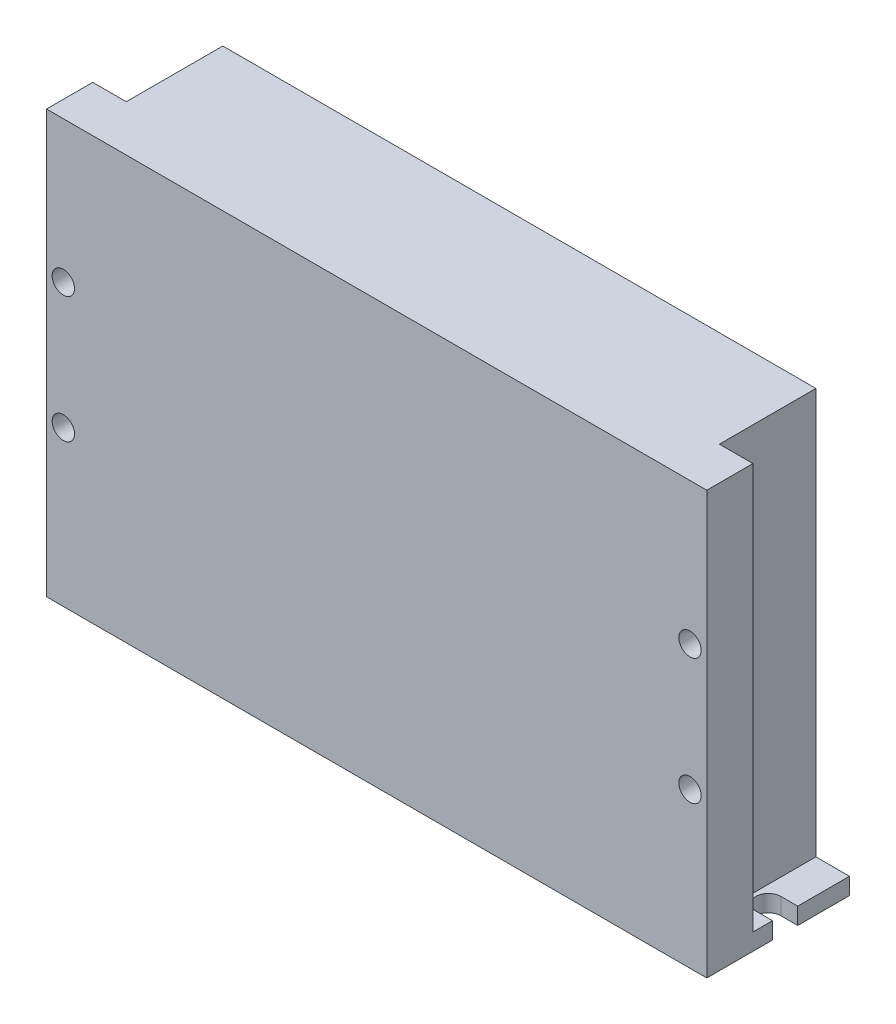
ISO-10303-21;
HEADER;
FILE_DESCRIPTION(('STEP AP214'),'2;1');
FILE_NAME('part.step','',(''),(''),'','','');
FILE_SCHEMA(('AUTOMOTIVE_DESIGN { 1 0 10303 214 1 1 1 1 }'));
ENDSEC;
DATA;
#1=APPLICATION_CONTEXT('core data for automotive mechanical design processes');
#2=APPLICATION_PROTOCOL_DEFINITION('international standard','automotive_design',2000,#1);
#3=PRODUCT_CONTEXT('',#1,'mechanical');
#4=PRODUCT('Part','Part','',(#3));
#5=PRODUCT_RELATED_PRODUCT_CATEGORY('part','',(#4));
#6=PRODUCT_DEFINITION_FORMATION('','',#4);
#7=PRODUCT_DEFINITION_CONTEXT('part definition',#1,'design');
#8=PRODUCT_DEFINITION('design','',#6,#7);
#9=PRODUCT_DEFINITION_SHAPE('','',#8);
#10=(LENGTH_UNIT() NAMED_UNIT(*) SI_UNIT(.MILLI.,.METRE.));
#11=(NAMED_UNIT(*) PLANE_ANGLE_UNIT() SI_UNIT($,.RADIAN.));
#12=(NAMED_UNIT(*) SI_UNIT($,.STERADIAN.) SOLID_ANGLE_UNIT());
#13=UNCERTAINTY_MEASURE_WITH_UNIT(LENGTH_MEASURE(1.E-05),#10,'distance_accuracy_value','');
#14=(GEOMETRIC_REPRESENTATION_CONTEXT(3) GLOBAL_UNCERTAINTY_ASSIGNED_CONTEXT((#13)) GLOBAL_UNIT_ASSIGNED_CONTEXT((#10,
#11,#12)) REPRESENTATION_CONTEXT('',''));
#15=CARTESIAN_POINT('',(0.,0.,0.));
#16=DIRECTION('',(0.,0.,1.));
#17=DIRECTION('',(1.,0.,0.));
#18=AXIS2_PLACEMENT_3D('',#15,#16,#17);
#19=CARTESIAN_POINT('',(0.,75.5,0.));
#20=DIRECTION('',(1.,0.,0.));
#21=DIRECTION('',(0.,0.,-1.));
#22=AXIS2_PLACEMENT_3D('',#19,#20,#21);
#23=PLANE('',#22);
#24=DIRECTION('',(0.,0.,1.));
#25=VECTOR('',#24,1.);
#26=CARTESIAN_POINT('',(0.,0.,0.));
#27=LINE('',#26,#25);
#28=CARTESIAN_POINT('',(0.,0.,0.));
#29=VERTEX_POINT('',#28);
#30=CARTESIAN_POINT('',(0.,0.,9.25));
#31=VERTEX_POINT('',#30);
#32=EDGE_CURVE('E182',#29,#31,#27,.T.);
#33=ORIENTED_EDGE('',*,*,#32,.T.);
#34=DIRECTION('',(0.,1.,0.));
#35=VECTOR('',#34,1.);
#36=CARTESIAN_POINT('',(0.,0.,9.25));
#37=LINE('',#36,#35);
#38=CARTESIAN_POINT('',(0.,3.,9.25));
#39=VERTEX_POINT('',#38);
#40=EDGE_CURVE('E285',#31,#39,#37,.T.);
#41=ORIENTED_EDGE('',*,*,#40,.T.);
#42=DIRECTION('',(0.,0.,1.));
#43=VECTOR('',#42,1.);
#44=CARTESIAN_POINT('',(0.,3.,0.));
#45=LINE('',#44,#43);
#46=CARTESIAN_POINT('',(0.,3.,0.));
#47=VERTEX_POINT('',#46);
#48=EDGE_CURVE('E252',#47,#39,#45,.T.);
#49=ORIENTED_EDGE('',*,*,#48,.F.);
#50=DIRECTION('',(0.,-1.,0.));
#51=VECTOR('',#50,1.);
#52=CARTESIAN_POINT('',(0.,75.5,0.));
#53=LINE('',#52,#51);
#54=EDGE_CURVE('E201',#47,#29,#53,.T.);
#55=ORIENTED_EDGE('',*,*,#54,.T.);
#56=EDGE_LOOP('',(#33,#41,#49,#55));
#57=FACE_BOUND('',#56,.T.);
#58=ADVANCED_FACE('F35',(#57),#23,.F.);
#59=CARTESIAN_POINT('',(118.,75.5,0.));
#60=DIRECTION('',(-1.,0.,0.));
#61=DIRECTION('',(0.,0.,1.));
#62=AXIS2_PLACEMENT_3D('',#59,#60,#61);
#63=PLANE('',#62);
#64=DIRECTION('',(0.,0.,-1.));
#65=VECTOR('',#64,1.);
#66=CARTESIAN_POINT('',(118.,0.,0.));
#67=LINE('',#66,#65);
#68=CARTESIAN_POINT('',(118.,0.,25.5));
#69=VERTEX_POINT('',#68);
#70=CARTESIAN_POINT('',(118.,0.,13.75));
#71=VERTEX_POINT('',#70);
#72=EDGE_CURVE('E194',#69,#71,#67,.T.);
#73=ORIENTED_EDGE('',*,*,#72,.T.);
#74=DIRECTION('',(0.,1.,0.));
#75=VECTOR('',#74,1.);
#76=CARTESIAN_POINT('',(118.,0.,13.75));
#77=LINE('',#76,#75);
#78=CARTESIAN_POINT('',(118.,3.,13.75));
#79=VERTEX_POINT('',#78);
#80=EDGE_CURVE('E234',#71,#79,#77,.T.);
#81=ORIENTED_EDGE('',*,*,#80,.T.);
#82=DIRECTION('',(0.,0.,-1.));
#83=VECTOR('',#82,1.);
#84=CARTESIAN_POINT('',(118.,3.,0.));
#85=LINE('',#84,#83);
#86=CARTESIAN_POINT('',(118.,3.,17.25));
#87=VERTEX_POINT('',#86);
#88=EDGE_CURVE('E267',#87,#79,#85,.T.);
#89=ORIENTED_EDGE('',*,*,#88,.F.);
#90=DIRECTION('',(0.,1.,0.));
#91=VECTOR('',#90,1.);
#92=CARTESIAN_POINT('',(118.,3.,17.25));
#93=LINE('',#92,#91);
#94=CARTESIAN_POINT('',(118.,75.5,17.25));
#95=VERTEX_POINT('',#94);
#96=EDGE_CURVE('E261',#87,#95,#93,.T.);
#97=ORIENTED_EDGE('',*,*,#96,.T.);
#98=DIRECTION('',(0.,0.,-1.));
#99=VECTOR('',#98,1.);
#100=CARTESIAN_POINT('',(118.,75.5,0.));
#101=LINE('',#100,#99);
#102=CARTESIAN_POINT('',(118.,75.5,25.5));
#103=VERTEX_POINT('',#102);
#104=EDGE_CURVE('E213',#103,#95,#101,.T.);
#105=ORIENTED_EDGE('',*,*,#104,.F.);
#106=DIRECTION('',(0.,-1.,0.));
#107=VECTOR('',#106,1.);
#108=CARTESIAN_POINT('',(118.,75.5,25.5));
#109=LINE('',#108,#107);
#110=EDGE_CURVE('E43',#103,#69,#109,.T.);
#111=ORIENTED_EDGE('',*,*,#110,.T.);
#112=EDGE_LOOP('',(#73,#81,#89,#97,#105,#111));
#113=FACE_BOUND('',#112,.T.);
#114=ADVANCED_FACE('F209',(#113),#63,.F.);
#115=CARTESIAN_POINT('',(0.,3.,13.75));
#116=VERTEX_POINT('',#115);
#117=CARTESIAN_POINT('',(0.,3.,17.25));
#118=VERTEX_POINT('',#117);
#119=EDGE_CURVE('E176',#116,#118,#45,.T.);
#120=ORIENTED_EDGE('',*,*,#119,.F.);
#121=DIRECTION('',(0.,1.,0.));
#122=VECTOR('',#121,1.);
#123=CARTESIAN_POINT('',(0.,0.,13.75));
#124=LINE('',#123,#122);
#125=CARTESIAN_POINT('',(0.,0.,13.75));
#126=VERTEX_POINT('',#125);
#127=EDGE_CURVE('E58',#126,#116,#124,.T.);
#128=ORIENTED_EDGE('',*,*,#127,.F.);
#129=CARTESIAN_POINT('',(0.,0.,25.5));
#130=VERTEX_POINT('',#129);
#131=EDGE_CURVE('E173',#126,#130,#27,.T.);
#132=ORIENTED_EDGE('',*,*,#131,.T.);
#133=DIRECTION('',(0.,-1.,0.));
#134=VECTOR('',#133,1.);
#135=CARTESIAN_POINT('',(0.,75.5,25.5));
#136=LINE('',#135,#134);
#137=CARTESIAN_POINT('',(0.,75.5,25.5));
#138=VERTEX_POINT('',#137);
#139=EDGE_CURVE('E11',#138,#130,#136,.T.);
#140=ORIENTED_EDGE('',*,*,#139,.F.);
#141=DIRECTION('',(0.,0.,1.));
#142=VECTOR('',#141,1.);
#143=CARTESIAN_POINT('',(0.,75.5,0.));
#144=LINE('',#143,#142);
#145=CARTESIAN_POINT('',(0.,75.5,17.25));
#146=VERTEX_POINT('',#145);
#147=EDGE_CURVE('E200',#146,#138,#144,.T.);
#148=ORIENTED_EDGE('',*,*,#147,.F.);
#149=DIRECTION('',(0.,1.,0.));
#150=VECTOR('',#149,1.);
#151=CARTESIAN_POINT('',(0.,3.,17.25));
#152=LINE('',#151,#150);
#153=EDGE_CURVE('E186',#118,#146,#152,.T.);
#154=ORIENTED_EDGE('',*,*,#153,.F.);
#155=EDGE_LOOP('',(#120,#128,#132,#140,#148,#154));
#156=FACE_BOUND('',#155,.T.);
#157=ADVANCED_FACE('F37',(#156),#23,.F.);
#158=CARTESIAN_POINT('',(0.,75.5,25.5));
#159=DIRECTION('',(0.,0.,-1.));
#160=DIRECTION('',(-1.,0.,0.));
#161=AXIS2_PLACEMENT_3D('',#158,#159,#160);
#162=PLANE('',#161);
#163=CARTESIAN_POINT('',(115.,27.7,25.5));
#164=DIRECTION('',(0.,0.,-1.));
#165=DIRECTION('',(-1.,0.,0.));
#166=AXIS2_PLACEMENT_3D('',#163,#164,#165);
#167=CIRCLE('',#166,2.);
#168=CARTESIAN_POINT('',(113.,27.7,25.5));
#169=VERTEX_POINT('',#168);
#170=EDGE_CURVE('E514',#169,#169,#167,.T.);
#171=ORIENTED_EDGE('',*,*,#170,.T.);
#172=EDGE_LOOP('',(#171));
#173=FACE_BOUND('',#172,.T.);
#174=CARTESIAN_POINT('',(3.,50.2,25.5));
#175=DIRECTION('',(0.,0.,-1.));
#176=DIRECTION('',(-1.,0.,0.));
#177=AXIS2_PLACEMENT_3D('',#174,#175,#176);
#178=CIRCLE('',#177,2.);
#179=CARTESIAN_POINT('',(1.,50.2,25.5));
#180=VERTEX_POINT('',#179);
#181=EDGE_CURVE('E518',#180,#180,#178,.T.);
#182=ORIENTED_EDGE('',*,*,#181,.T.);
#183=EDGE_LOOP('',(#182));
#184=FACE_BOUND('',#183,.T.);
#185=CARTESIAN_POINT('',(3.,27.7,25.5));
#186=DIRECTION('',(0.,0.,-1.));
#187=DIRECTION('',(-1.,0.,0.));
#188=AXIS2_PLACEMENT_3D('',#185,#186,#187);
#189=CIRCLE('',#188,2.);
#190=CARTESIAN_POINT('',(1.,27.7,25.5));
#191=VERTEX_POINT('',#190);
#192=EDGE_CURVE('E529',#191,#191,#189,.T.);
#193=ORIENTED_EDGE('',*,*,#192,.T.);
#194=EDGE_LOOP('',(#193));
#195=FACE_BOUND('',#194,.T.);
#196=CARTESIAN_POINT('',(115.,50.2,25.5));
#197=DIRECTION('',(0.,0.,-1.));
#198=DIRECTION('',(-1.,0.,0.));
#199=AXIS2_PLACEMENT_3D('',#196,#197,#198);
#200=CIRCLE('',#199,2.);
#201=CARTESIAN_POINT('',(113.,50.2,25.5));
#202=VERTEX_POINT('',#201);
#203=EDGE_CURVE('E237',#202,#202,#200,.T.);
#204=ORIENTED_EDGE('',*,*,#203,.T.);
#205=EDGE_LOOP('',(#204));
#206=FACE_BOUND('',#205,.T.);
#207=DIRECTION('',(1.,0.,0.));
#208=VECTOR('',#207,1.);
#209=CARTESIAN_POINT('',(0.,0.,25.5));
#210=LINE('',#209,#208);
#211=EDGE_CURVE('E181',#130,#69,#210,.T.);
#212=ORIENTED_EDGE('',*,*,#211,.T.);
#213=ORIENTED_EDGE('',*,*,#110,.F.);
#214=DIRECTION('',(1.,0.,0.));
#215=VECTOR('',#214,1.);
#216=CARTESIAN_POINT('',(0.,75.5,25.5));
#217=LINE('',#216,#215);
#218=EDGE_CURVE('E292',#138,#103,#217,.T.);
#219=ORIENTED_EDGE('',*,*,#218,.F.);
#220=ORIENTED_EDGE('',*,*,#139,.T.);
#221=EDGE_LOOP('',(#212,#213,#219,#220));
#222=FACE_BOUND('',#221,.T.);
#223=ADVANCED_FACE('F318',(#173,#184,#195,#206,#222),#162,.F.);
#224=CARTESIAN_POINT('',(118.,3.,9.25));
#225=VERTEX_POINT('',#224);
#226=CARTESIAN_POINT('',(118.,3.,0.));
#227=VERTEX_POINT('',#226);
#228=EDGE_CURVE('E271',#225,#227,#85,.T.);
#229=ORIENTED_EDGE('',*,*,#228,.F.);
#230=DIRECTION('',(0.,1.,0.));
#231=VECTOR('',#230,1.);
#232=CARTESIAN_POINT('',(118.,0.,9.25));
#233=LINE('',#232,#231);
#234=CARTESIAN_POINT('',(118.,0.,9.25));
#235=VERTEX_POINT('',#234);
#236=EDGE_CURVE('E50',#235,#225,#233,.T.);
#237=ORIENTED_EDGE('',*,*,#236,.F.);
#238=CARTESIAN_POINT('',(118.,0.,0.));
#239=VERTEX_POINT('',#238);
#240=EDGE_CURVE('E193',#235,#239,#67,.T.);
#241=ORIENTED_EDGE('',*,*,#240,.T.);
#242=DIRECTION('',(0.,-1.,0.));
#243=VECTOR('',#242,1.);
#244=CARTESIAN_POINT('',(118.,75.5,0.));
#245=LINE('',#244,#243);
#246=EDGE_CURVE('E203',#227,#239,#245,.T.);
#247=ORIENTED_EDGE('',*,*,#246,.F.);
#248=EDGE_LOOP('',(#229,#237,#241,#247));
#249=FACE_BOUND('',#248,.T.);
#250=ADVANCED_FACE('F320',(#249),#63,.F.);
#251=CARTESIAN_POINT('',(0.,75.5,0.));
#252=DIRECTION('',(0.,0.,1.));
#253=DIRECTION('',(1.,0.,0.));
#254=AXIS2_PLACEMENT_3D('',#251,#252,#253);
#255=PLANE('',#254);
#256=DIRECTION('',(-1.,0.,0.));
#257=VECTOR('',#256,1.);
#258=CARTESIAN_POINT('',(6.,3.,0.));
#259=LINE('',#258,#257);
#260=CARTESIAN_POINT('',(6.,3.,0.));
#261=VERTEX_POINT('',#260);
#262=EDGE_CURVE('E249',#261,#47,#259,.T.);
#263=ORIENTED_EDGE('',*,*,#262,.F.);
#264=DIRECTION('',(0.,1.,0.));
#265=VECTOR('',#264,1.);
#266=CARTESIAN_POINT('',(6.,3.,0.));
#267=LINE('',#266,#265);
#268=CARTESIAN_POINT('',(6.,75.5,0.));
#269=VERTEX_POINT('',#268);
#270=EDGE_CURVE('E258',#261,#269,#267,.T.);
#271=ORIENTED_EDGE('',*,*,#270,.T.);
#272=DIRECTION('',(-1.,0.,0.));
#273=VECTOR('',#272,1.);
#274=CARTESIAN_POINT('',(0.,75.5,0.));
#275=LINE('',#274,#273);
#276=CARTESIAN_POINT('',(112.,75.5,0.));
#277=VERTEX_POINT('',#276);
#278=EDGE_CURVE('E190',#277,#269,#275,.T.);
#279=ORIENTED_EDGE('',*,*,#278,.F.);
#280=DIRECTION('',(0.,1.,0.));
#281=VECTOR('',#280,1.);
#282=CARTESIAN_POINT('',(112.,3.,0.));
#283=LINE('',#282,#281);
#284=CARTESIAN_POINT('',(112.,3.,0.));
#285=VERTEX_POINT('',#284);
#286=EDGE_CURVE('E280',#285,#277,#283,.T.);
#287=ORIENTED_EDGE('',*,*,#286,.F.);
#288=DIRECTION('',(-1.,0.,0.));
#289=VECTOR('',#288,1.);
#290=CARTESIAN_POINT('',(118.,3.,0.));
#291=LINE('',#290,#289);
#292=EDGE_CURVE('E270',#227,#285,#291,.T.);
#293=ORIENTED_EDGE('',*,*,#292,.F.);
#294=ORIENTED_EDGE('',*,*,#246,.T.);
#295=DIRECTION('',(-1.,0.,0.));
#296=VECTOR('',#295,1.);
#297=CARTESIAN_POINT('',(0.,0.,0.));
#298=LINE('',#297,#296);
#299=EDGE_CURVE('E197',#239,#29,#298,.T.);
#300=ORIENTED_EDGE('',*,*,#299,.T.);
#301=ORIENTED_EDGE('',*,*,#54,.F.);
#302=EDGE_LOOP('',(#263,#271,#279,#287,#293,#294,#300,#301));
#303=FACE_BOUND('',#302,.T.);
#304=ADVANCED_FACE('F304',(#303),#255,.F.);
#305=CARTESIAN_POINT('',(0.,75.5,0.));
#306=DIRECTION('',(0.,1.,0.));
#307=DIRECTION('',(0.,0.,1.));
#308=AXIS2_PLACEMENT_3D('',#305,#306,#307);
#309=PLANE('',#308);
#310=DIRECTION('',(0.,0.,-1.));
#311=VECTOR('',#310,1.);
#312=CARTESIAN_POINT('',(6.,75.5,17.25));
#313=LINE('',#312,#311);
#314=CARTESIAN_POINT('',(6.,75.5,17.25));
#315=VERTEX_POINT('',#314);
#316=EDGE_CURVE('E259',#315,#269,#313,.T.);
#317=ORIENTED_EDGE('',*,*,#316,.F.);
#318=DIRECTION('',(1.,0.,0.));
#319=VECTOR('',#318,1.);
#320=CARTESIAN_POINT('',(0.,75.5,17.25));
#321=LINE('',#320,#319);
#322=EDGE_CURVE('E250',#146,#315,#321,.T.);
#323=ORIENTED_EDGE('',*,*,#322,.F.);
#324=ORIENTED_EDGE('',*,*,#147,.T.);
#325=ORIENTED_EDGE('',*,*,#218,.T.);
#326=ORIENTED_EDGE('',*,*,#104,.T.);
#327=DIRECTION('',(1.,0.,0.));
#328=VECTOR('',#327,1.);
#329=CARTESIAN_POINT('',(118.,75.5,17.25));
#330=LINE('',#329,#328);
#331=CARTESIAN_POINT('',(112.,75.5,17.25));
#332=VERTEX_POINT('',#331);
#333=EDGE_CURVE('E284',#332,#95,#330,.T.);
#334=ORIENTED_EDGE('',*,*,#333,.F.);
#335=DIRECTION('',(0.,0.,1.));
#336=VECTOR('',#335,1.);
#337=CARTESIAN_POINT('',(112.,75.5,0.));
#338=LINE('',#337,#336);
#339=EDGE_CURVE('E281',#277,#332,#338,.T.);
#340=ORIENTED_EDGE('',*,*,#339,.F.);
#341=ORIENTED_EDGE('',*,*,#278,.T.);
#342=EDGE_LOOP('',(#317,#323,#324,#325,#326,#334,#340,#341));
#343=FACE_BOUND('',#342,.T.);
#344=ADVANCED_FACE('F299',(#343),#309,.T.);
#345=CARTESIAN_POINT('',(0.,0.,0.));
#346=DIRECTION('',(0.,1.,0.));
#347=DIRECTION('',(0.,0.,1.));
#348=AXIS2_PLACEMENT_3D('',#345,#346,#347);
#349=PLANE('',#348);
#350=CARTESIAN_POINT('',(3.,0.,11.5));
#351=DIRECTION('',(0.,1.,0.));
#352=DIRECTION('',(0.,0.,1.));
#353=AXIS2_PLACEMENT_3D('',#350,#351,#352);
#354=CIRCLE('',#353,2.25);
#355=CARTESIAN_POINT('',(3.,0.,13.75));
#356=VERTEX_POINT('',#355);
#357=CARTESIAN_POINT('',(3.,0.,9.25));
#358=VERTEX_POINT('',#357);
#359=EDGE_CURVE('E167',#356,#358,#354,.T.);
#360=ORIENTED_EDGE('',*,*,#359,.T.);
#361=DIRECTION('',(-1.,0.,0.));
#362=VECTOR('',#361,1.);
#363=CARTESIAN_POINT('',(0.,0.,9.25));
#364=LINE('',#363,#362);
#365=EDGE_CURVE('E177',#358,#31,#364,.T.);
#366=ORIENTED_EDGE('',*,*,#365,.T.);
#367=ORIENTED_EDGE('',*,*,#32,.F.);
#368=ORIENTED_EDGE('',*,*,#299,.F.);
#369=ORIENTED_EDGE('',*,*,#240,.F.);
#370=DIRECTION('',(-1.,0.,0.));
#371=VECTOR('',#370,1.);
#372=CARTESIAN_POINT('',(118.,0.,9.25));
#373=LINE('',#372,#371);
#374=CARTESIAN_POINT('',(115.,0.,9.25));
#375=VERTEX_POINT('',#374);
#376=EDGE_CURVE('E224',#235,#375,#373,.T.);
#377=ORIENTED_EDGE('',*,*,#376,.T.);
#378=CARTESIAN_POINT('',(115.,0.,11.5));
#379=DIRECTION('',(0.,1.,0.));
#380=DIRECTION('',(0.,0.,-1.));
#381=AXIS2_PLACEMENT_3D('',#378,#379,#380);
#382=CIRCLE('',#381,2.25);
#383=CARTESIAN_POINT('',(115.,0.,13.75));
#384=VERTEX_POINT('',#383);
#385=EDGE_CURVE('E222',#375,#384,#382,.T.);
#386=ORIENTED_EDGE('',*,*,#385,.T.);
#387=DIRECTION('',(1.,0.,0.));
#388=VECTOR('',#387,1.);
#389=CARTESIAN_POINT('',(118.,0.,13.75));
#390=LINE('',#389,#388);
#391=EDGE_CURVE('E219',#384,#71,#390,.T.);
#392=ORIENTED_EDGE('',*,*,#391,.T.);
#393=ORIENTED_EDGE('',*,*,#72,.F.);
#394=ORIENTED_EDGE('',*,*,#211,.F.);
#395=ORIENTED_EDGE('',*,*,#131,.F.);
#396=DIRECTION('',(1.,0.,0.));
#397=VECTOR('',#396,1.);
#398=CARTESIAN_POINT('',(0.,0.,13.75));
#399=LINE('',#398,#397);
#400=EDGE_CURVE('E160',#126,#356,#399,.T.);
#401=ORIENTED_EDGE('',*,*,#400,.T.);
#402=EDGE_LOOP('',(#360,#366,#367,#368,#369,#377,#386,#392,#393,#394,#395,#401));
#403=FACE_BOUND('',#402,.T.);
#404=ADVANCED_FACE('F179',(#403),#349,.F.);
#405=CARTESIAN_POINT('',(118.,3.,17.25));
#406=DIRECTION('',(0.,0.,1.));
#407=DIRECTION('',(1.,0.,0.));
#408=AXIS2_PLACEMENT_3D('',#405,#406,#407);
#409=PLANE('',#408);
#410=CARTESIAN_POINT('',(115.,27.7,17.25));
#411=DIRECTION('',(0.,0.,-1.));
#412=DIRECTION('',(-1.,0.,0.));
#413=AXIS2_PLACEMENT_3D('',#410,#411,#412);
#414=CIRCLE('',#413,2.);
#415=CARTESIAN_POINT('',(113.,27.7,17.25));
#416=VERTEX_POINT('',#415);
#417=EDGE_CURVE('E517',#416,#416,#414,.T.);
#418=ORIENTED_EDGE('',*,*,#417,.F.);
#419=EDGE_LOOP('',(#418));
#420=FACE_BOUND('',#419,.T.);
#421=CARTESIAN_POINT('',(115.,50.2,17.25));
#422=DIRECTION('',(0.,0.,-1.));
#423=DIRECTION('',(-1.,0.,0.));
#424=AXIS2_PLACEMENT_3D('',#421,#422,#423);
#425=CIRCLE('',#424,2.);
#426=CARTESIAN_POINT('',(113.,50.2,17.25));
#427=VERTEX_POINT('',#426);
#428=EDGE_CURVE('E520',#427,#427,#425,.T.);
#429=ORIENTED_EDGE('',*,*,#428,.F.);
#430=EDGE_LOOP('',(#429));
#431=FACE_BOUND('',#430,.T.);
#432=ORIENTED_EDGE('',*,*,#333,.T.);
#433=ORIENTED_EDGE('',*,*,#96,.F.);
#434=DIRECTION('',(1.,0.,0.));
#435=VECTOR('',#434,1.);
#436=CARTESIAN_POINT('',(118.,3.,17.25));
#437=LINE('',#436,#435);
#438=CARTESIAN_POINT('',(112.,3.,17.25));
#439=VERTEX_POINT('',#438);
#440=EDGE_CURVE('E277',#439,#87,#437,.T.);
#441=ORIENTED_EDGE('',*,*,#440,.F.);
#442=DIRECTION('',(0.,1.,0.));
#443=VECTOR('',#442,1.);
#444=CARTESIAN_POINT('',(112.,3.,17.25));
#445=LINE('',#444,#443);
#446=EDGE_CURVE('E288',#439,#332,#445,.T.);
#447=ORIENTED_EDGE('',*,*,#446,.T.);
#448=EDGE_LOOP('',(#432,#433,#441,#447));
#449=FACE_BOUND('',#448,.T.);
#450=ADVANCED_FACE('F394',(#420,#431,#449),#409,.F.);
#451=CARTESIAN_POINT('',(112.,3.,0.));
#452=DIRECTION('',(-1.,0.,0.));
#453=DIRECTION('',(0.,0.,1.));
#454=AXIS2_PLACEMENT_3D('',#451,#452,#453);
#455=PLANE('',#454);
#456=ORIENTED_EDGE('',*,*,#339,.T.);
#457=ORIENTED_EDGE('',*,*,#446,.F.);
#458=DIRECTION('',(0.,0.,1.));
#459=VECTOR('',#458,1.);
#460=CARTESIAN_POINT('',(112.,3.,0.));
#461=LINE('',#460,#459);
#462=EDGE_CURVE('E274',#285,#439,#461,.T.);
#463=ORIENTED_EDGE('',*,*,#462,.F.);
#464=ORIENTED_EDGE('',*,*,#286,.T.);
#465=EDGE_LOOP('',(#456,#457,#463,#464));
#466=FACE_BOUND('',#465,.T.);
#467=ADVANCED_FACE('F392',(#466),#455,.F.);
#468=CARTESIAN_POINT('',(0.,3.,0.));
#469=DIRECTION('',(0.,-1.,0.));
#470=DIRECTION('',(0.,0.,-1.));
#471=AXIS2_PLACEMENT_3D('',#468,#469,#470);
#472=PLANE('',#471);
#473=ORIENTED_EDGE('',*,*,#88,.T.);
#474=DIRECTION('',(1.,0.,0.));
#475=VECTOR('',#474,1.);
#476=CARTESIAN_POINT('',(118.,3.,13.75));
#477=LINE('',#476,#475);
#478=CARTESIAN_POINT('',(115.,3.,13.75));
#479=VERTEX_POINT('',#478);
#480=EDGE_CURVE('E235',#479,#79,#477,.T.);
#481=ORIENTED_EDGE('',*,*,#480,.F.);
#482=CARTESIAN_POINT('',(115.,3.,11.5));
#483=DIRECTION('',(0.,1.,0.));
#484=DIRECTION('',(0.,0.,-1.));
#485=AXIS2_PLACEMENT_3D('',#482,#483,#484);
#486=CIRCLE('',#485,2.25);
#487=CARTESIAN_POINT('',(115.,3.,9.25));
#488=VERTEX_POINT('',#487);
#489=EDGE_CURVE('E225',#488,#479,#486,.T.);
#490=ORIENTED_EDGE('',*,*,#489,.F.);
#491=DIRECTION('',(-1.,0.,0.));
#492=VECTOR('',#491,1.);
#493=CARTESIAN_POINT('',(118.,3.,9.25));
#494=LINE('',#493,#492);
#495=EDGE_CURVE('E229',#225,#488,#494,.T.);
#496=ORIENTED_EDGE('',*,*,#495,.F.);
#497=ORIENTED_EDGE('',*,*,#228,.T.);
#498=ORIENTED_EDGE('',*,*,#292,.T.);
#499=ORIENTED_EDGE('',*,*,#462,.T.);
#500=ORIENTED_EDGE('',*,*,#440,.T.);
#501=EDGE_LOOP('',(#473,#481,#490,#496,#497,#498,#499,#500));
#502=FACE_BOUND('',#501,.T.);
#503=ADVANCED_FACE('F389',(#502),#472,.F.);
#504=CARTESIAN_POINT('',(6.,3.,17.25));
#505=DIRECTION('',(1.,0.,0.));
#506=DIRECTION('',(0.,0.,-1.));
#507=AXIS2_PLACEMENT_3D('',#504,#505,#506);
#508=PLANE('',#507);
#509=ORIENTED_EDGE('',*,*,#316,.T.);
#510=ORIENTED_EDGE('',*,*,#270,.F.);
#511=DIRECTION('',(0.,0.,-1.));
#512=VECTOR('',#511,1.);
#513=CARTESIAN_POINT('',(6.,3.,17.25));
#514=LINE('',#513,#512);
#515=CARTESIAN_POINT('',(6.,3.,17.25));
#516=VERTEX_POINT('',#515);
#517=EDGE_CURVE('E246',#516,#261,#514,.T.);
#518=ORIENTED_EDGE('',*,*,#517,.F.);
#519=DIRECTION('',(0.,1.,0.));
#520=VECTOR('',#519,1.);
#521=CARTESIAN_POINT('',(6.,3.,17.25));
#522=LINE('',#521,#520);
#523=EDGE_CURVE('E183',#516,#315,#522,.T.);
#524=ORIENTED_EDGE('',*,*,#523,.T.);
#525=EDGE_LOOP('',(#509,#510,#518,#524));
#526=FACE_BOUND('',#525,.T.);
#527=ADVANCED_FACE('F309',(#526),#508,.F.);
#528=CARTESIAN_POINT('',(0.,3.,17.25));
#529=DIRECTION('',(0.,0.,1.));
#530=DIRECTION('',(1.,0.,0.));
#531=AXIS2_PLACEMENT_3D('',#528,#529,#530);
#532=PLANE('',#531);
#533=CARTESIAN_POINT('',(3.,50.2,17.25));
#534=DIRECTION('',(0.,0.,-1.));
#535=DIRECTION('',(-1.,0.,0.));
#536=AXIS2_PLACEMENT_3D('',#533,#534,#535);
#537=CIRCLE('',#536,2.);
#538=CARTESIAN_POINT('',(1.,50.2,17.25));
#539=VERTEX_POINT('',#538);
#540=EDGE_CURVE('E523',#539,#539,#537,.T.);
#541=ORIENTED_EDGE('',*,*,#540,.F.);
#542=EDGE_LOOP('',(#541));
#543=FACE_BOUND('',#542,.T.);
#544=CARTESIAN_POINT('',(3.,27.7,17.25));
#545=DIRECTION('',(0.,0.,-1.));
#546=DIRECTION('',(-1.,0.,0.));
#547=AXIS2_PLACEMENT_3D('',#544,#545,#546);
#548=CIRCLE('',#547,2.);
#549=CARTESIAN_POINT('',(1.,27.7,17.25));
#550=VERTEX_POINT('',#549);
#551=EDGE_CURVE('E548',#550,#550,#548,.T.);
#552=ORIENTED_EDGE('',*,*,#551,.F.);
#553=EDGE_LOOP('',(#552));
#554=FACE_BOUND('',#553,.T.);
#555=ORIENTED_EDGE('',*,*,#322,.T.);
#556=ORIENTED_EDGE('',*,*,#523,.F.);
#557=DIRECTION('',(1.,0.,0.));
#558=VECTOR('',#557,1.);
#559=CARTESIAN_POINT('',(0.,3.,17.25));
#560=LINE('',#559,#558);
#561=EDGE_CURVE('E255',#118,#516,#560,.T.);
#562=ORIENTED_EDGE('',*,*,#561,.F.);
#563=ORIENTED_EDGE('',*,*,#153,.T.);
#564=EDGE_LOOP('',(#555,#556,#562,#563));
#565=FACE_BOUND('',#564,.T.);
#566=ADVANCED_FACE('F316',(#543,#554,#565),#532,.F.);
#567=CARTESIAN_POINT('',(0.,3.,0.));
#568=DIRECTION('',(0.,1.,0.));
#569=DIRECTION('',(0.,0.,1.));
#570=AXIS2_PLACEMENT_3D('',#567,#568,#569);
#571=PLANE('',#570);
#572=DIRECTION('',(-1.,0.,0.));
#573=VECTOR('',#572,1.);
#574=CARTESIAN_POINT('',(0.,3.,9.25));
#575=LINE('',#574,#573);
#576=CARTESIAN_POINT('',(3.,3.,9.25));
#577=VERTEX_POINT('',#576);
#578=EDGE_CURVE('E168',#577,#39,#575,.T.);
#579=ORIENTED_EDGE('',*,*,#578,.F.);
#580=CARTESIAN_POINT('',(3.,3.,11.5));
#581=DIRECTION('',(0.,1.,0.));
#582=DIRECTION('',(0.,0.,1.));
#583=AXIS2_PLACEMENT_3D('',#580,#581,#582);
#584=CIRCLE('',#583,2.25);
#585=CARTESIAN_POINT('',(3.,3.,13.75));
#586=VERTEX_POINT('',#585);
#587=EDGE_CURVE('E349',#586,#577,#584,.T.);
#588=ORIENTED_EDGE('',*,*,#587,.F.);
#589=DIRECTION('',(1.,0.,0.));
#590=VECTOR('',#589,1.);
#591=CARTESIAN_POINT('',(0.,3.,13.75));
#592=LINE('',#591,#590);
#593=EDGE_CURVE('E241',#116,#586,#592,.T.);
#594=ORIENTED_EDGE('',*,*,#593,.F.);
#595=ORIENTED_EDGE('',*,*,#119,.T.);
#596=ORIENTED_EDGE('',*,*,#561,.T.);
#597=ORIENTED_EDGE('',*,*,#517,.T.);
#598=ORIENTED_EDGE('',*,*,#262,.T.);
#599=ORIENTED_EDGE('',*,*,#48,.T.);
#600=EDGE_LOOP('',(#579,#588,#594,#595,#596,#597,#598,#599));
#601=FACE_BOUND('',#600,.T.);
#602=ADVANCED_FACE('F312',(#601),#571,.T.);
#603=CARTESIAN_POINT('',(0.,0.,9.25));
#604=DIRECTION('',(0.,0.,-1.));
#605=DIRECTION('',(-1.,0.,0.));
#606=AXIS2_PLACEMENT_3D('',#603,#604,#605);
#607=PLANE('',#606);
#608=ORIENTED_EDGE('',*,*,#578,.T.);
#609=ORIENTED_EDGE('',*,*,#40,.F.);
#610=ORIENTED_EDGE('',*,*,#365,.F.);
#611=DIRECTION('',(0.,1.,0.));
#612=VECTOR('',#611,1.);
#613=CARTESIAN_POINT('',(3.,0.,9.25));
#614=LINE('',#613,#612);
#615=EDGE_CURVE('E354',#358,#577,#614,.T.);
#616=ORIENTED_EDGE('',*,*,#615,.T.);
#617=EDGE_LOOP('',(#608,#609,#610,#616));
#618=FACE_BOUND('',#617,.T.);
#619=ADVANCED_FACE('F358',(#618),#607,.F.);
#620=CARTESIAN_POINT('',(3.,0.,11.5));
#621=DIRECTION('',(0.,1.,0.));
#622=DIRECTION('',(0.,0.,1.));
#623=AXIS2_PLACEMENT_3D('',#620,#621,#622);
#624=CYLINDRICAL_SURFACE('',#623,2.25);
#625=ORIENTED_EDGE('',*,*,#587,.T.);
#626=ORIENTED_EDGE('',*,*,#615,.F.);
#627=ORIENTED_EDGE('',*,*,#359,.F.);
#628=DIRECTION('',(0.,1.,0.));
#629=VECTOR('',#628,1.);
#630=CARTESIAN_POINT('',(3.,0.,13.75));
#631=LINE('',#630,#629);
#632=EDGE_CURVE('E162',#356,#586,#631,.T.);
#633=ORIENTED_EDGE('',*,*,#632,.T.);
#634=EDGE_LOOP('',(#625,#626,#627,#633));
#635=FACE_BOUND('',#634,.T.);
#636=ADVANCED_FACE('F356',(#635),#624,.F.);
#637=CARTESIAN_POINT('',(0.,0.,13.75));
#638=DIRECTION('',(0.,0.,1.));
#639=DIRECTION('',(1.,0.,0.));
#640=AXIS2_PLACEMENT_3D('',#637,#638,#639);
#641=PLANE('',#640);
#642=ORIENTED_EDGE('',*,*,#593,.T.);
#643=ORIENTED_EDGE('',*,*,#632,.F.);
#644=ORIENTED_EDGE('',*,*,#400,.F.);
#645=ORIENTED_EDGE('',*,*,#127,.T.);
#646=EDGE_LOOP('',(#642,#643,#644,#645));
#647=FACE_BOUND('',#646,.T.);
#648=ADVANCED_FACE('F161',(#647),#641,.F.);
#649=CARTESIAN_POINT('',(118.,0.,13.75));
#650=DIRECTION('',(0.,0.,1.));
#651=DIRECTION('',(1.,0.,0.));
#652=AXIS2_PLACEMENT_3D('',#649,#650,#651);
#653=PLANE('',#652);
#654=ORIENTED_EDGE('',*,*,#480,.T.);
#655=ORIENTED_EDGE('',*,*,#80,.F.);
#656=ORIENTED_EDGE('',*,*,#391,.F.);
#657=DIRECTION('',(0.,1.,0.));
#658=VECTOR('',#657,1.);
#659=CARTESIAN_POINT('',(115.,0.,13.75));
#660=LINE('',#659,#658);
#661=EDGE_CURVE('E239',#384,#479,#660,.T.);
#662=ORIENTED_EDGE('',*,*,#661,.T.);
#663=EDGE_LOOP('',(#654,#655,#656,#662));
#664=FACE_BOUND('',#663,.T.);
#665=ADVANCED_FACE('F373',(#664),#653,.F.);
#666=CARTESIAN_POINT('',(115.,0.,11.5));
#667=DIRECTION('',(0.,1.,0.));
#668=DIRECTION('',(0.,0.,1.));
#669=AXIS2_PLACEMENT_3D('',#666,#667,#668);
#670=CYLINDRICAL_SURFACE('',#669,2.25);
#671=ORIENTED_EDGE('',*,*,#489,.T.);
#672=ORIENTED_EDGE('',*,*,#661,.F.);
#673=ORIENTED_EDGE('',*,*,#385,.F.);
#674=DIRECTION('',(0.,1.,0.));
#675=VECTOR('',#674,1.);
#676=CARTESIAN_POINT('',(115.,0.,9.25));
#677=LINE('',#676,#675);
#678=EDGE_CURVE('E242',#375,#488,#677,.T.);
#679=ORIENTED_EDGE('',*,*,#678,.T.);
#680=EDGE_LOOP('',(#671,#672,#673,#679));
#681=FACE_BOUND('',#680,.T.);
#682=ADVANCED_FACE('F374',(#681),#670,.F.);
#683=CARTESIAN_POINT('',(118.,0.,9.25));
#684=DIRECTION('',(0.,0.,-1.));
#685=DIRECTION('',(-1.,0.,0.));
#686=AXIS2_PLACEMENT_3D('',#683,#684,#685);
#687=PLANE('',#686);
#688=ORIENTED_EDGE('',*,*,#495,.T.);
#689=ORIENTED_EDGE('',*,*,#678,.F.);
#690=ORIENTED_EDGE('',*,*,#376,.F.);
#691=ORIENTED_EDGE('',*,*,#236,.T.);
#692=EDGE_LOOP('',(#688,#689,#690,#691));
#693=FACE_BOUND('',#692,.T.);
#694=ADVANCED_FACE('F377',(#693),#687,.F.);
#695=CARTESIAN_POINT('',(3.,27.7,25.5));
#696=DIRECTION('',(0.,0.,-1.));
#697=DIRECTION('',(-1.,0.,0.));
#698=AXIS2_PLACEMENT_3D('',#695,#696,#697);
#699=CYLINDRICAL_SURFACE('',#698,2.);
#700=ORIENTED_EDGE('',*,*,#192,.F.);
#701=EDGE_LOOP('',(#700));
#702=FACE_BOUND('',#701,.T.);
#703=ORIENTED_EDGE('',*,*,#551,.T.);
#704=EDGE_LOOP('',(#703));
#705=FACE_BOUND('',#704,.T.);
#706=ADVANCED_FACE('F381',(#702,#705),#699,.F.);
#707=CARTESIAN_POINT('',(3.,50.2,25.5));
#708=DIRECTION('',(0.,0.,-1.));
#709=DIRECTION('',(-1.,0.,0.));
#710=AXIS2_PLACEMENT_3D('',#707,#708,#709);
#711=CYLINDRICAL_SURFACE('',#710,2.);
#712=ORIENTED_EDGE('',*,*,#181,.F.);
#713=EDGE_LOOP('',(#712));
#714=FACE_BOUND('',#713,.T.);
#715=ORIENTED_EDGE('',*,*,#540,.T.);
#716=EDGE_LOOP('',(#715));
#717=FACE_BOUND('',#716,.T.);
#718=ADVANCED_FACE('F481',(#714,#717),#711,.F.);
#719=CARTESIAN_POINT('',(115.,50.2,25.5));
#720=DIRECTION('',(0.,0.,-1.));
#721=DIRECTION('',(-1.,0.,0.));
#722=AXIS2_PLACEMENT_3D('',#719,#720,#721);
#723=CYLINDRICAL_SURFACE('',#722,2.);
#724=ORIENTED_EDGE('',*,*,#203,.F.);
#725=EDGE_LOOP('',(#724));
#726=FACE_BOUND('',#725,.T.);
#727=ORIENTED_EDGE('',*,*,#428,.T.);
#728=EDGE_LOOP('',(#727));
#729=FACE_BOUND('',#728,.T.);
#730=ADVANCED_FACE('F368',(#726,#729),#723,.F.);
#731=CARTESIAN_POINT('',(115.,27.7,25.5));
#732=DIRECTION('',(0.,0.,-1.));
#733=DIRECTION('',(-1.,0.,0.));
#734=AXIS2_PLACEMENT_3D('',#731,#732,#733);
#735=CYLINDRICAL_SURFACE('',#734,2.);
#736=ORIENTED_EDGE('',*,*,#170,.F.);
#737=EDGE_LOOP('',(#736));
#738=FACE_BOUND('',#737,.T.);
#739=ORIENTED_EDGE('',*,*,#417,.T.);
#740=EDGE_LOOP('',(#739));
#741=FACE_BOUND('',#740,.T.);
#742=ADVANCED_FACE('F494',(#738,#741),#735,.F.);
#743=CLOSED_SHELL('',(#58,#114,#157,#223,#250,#304,#344,#404,#450,#467,#503,#527,#566,#602,#619,
#636,#648,#665,#682,#694,#706,#718,#730,#742));
#744=MANIFOLD_SOLID_BREP('B2',#743);
#745=ADVANCED_BREP_SHAPE_REPRESENTATION('',(#18,#744),#14);
#746=SHAPE_DEFINITION_REPRESENTATION(#9,#745);
ENDSEC;
END-ISO-10303-21;
